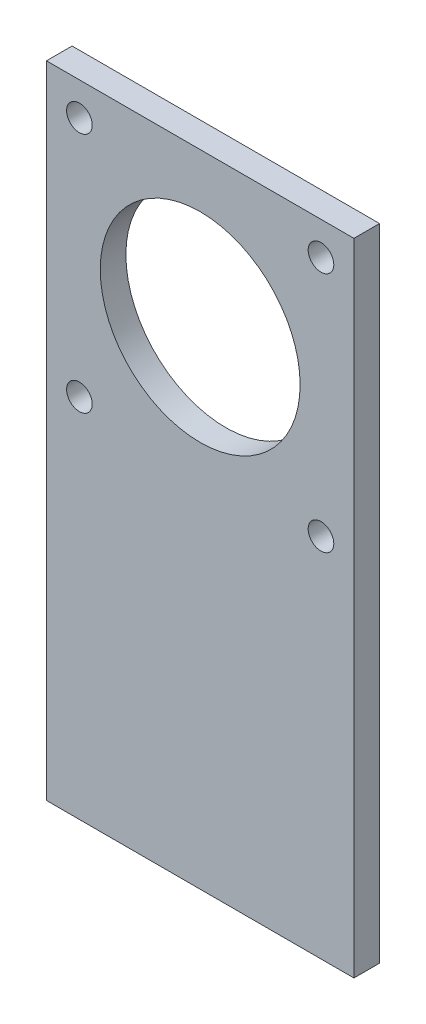
ISO-10303-21;
HEADER;
FILE_DESCRIPTION(('STEP AP214'),'2;1');
FILE_NAME('part.step','',(''),(''),'','','');
FILE_SCHEMA(('AUTOMOTIVE_DESIGN { 1 0 10303 214 1 1 1 1 }'));
ENDSEC;
DATA;
#1=APPLICATION_CONTEXT('core data for automotive mechanical design processes');
#2=APPLICATION_PROTOCOL_DEFINITION('international standard','automotive_design',2000,#1);
#3=PRODUCT_CONTEXT('',#1,'mechanical');
#4=PRODUCT('Part','Part','',(#3));
#5=PRODUCT_RELATED_PRODUCT_CATEGORY('part','',(#4));
#6=PRODUCT_DEFINITION_FORMATION('','',#4);
#7=PRODUCT_DEFINITION_CONTEXT('part definition',#1,'design');
#8=PRODUCT_DEFINITION('design','',#6,#7);
#9=PRODUCT_DEFINITION_SHAPE('','',#8);
#10=(LENGTH_UNIT() NAMED_UNIT(*) SI_UNIT(.MILLI.,.METRE.));
#11=(NAMED_UNIT(*) PLANE_ANGLE_UNIT() SI_UNIT($,.RADIAN.));
#12=(NAMED_UNIT(*) SI_UNIT($,.STERADIAN.) SOLID_ANGLE_UNIT());
#13=UNCERTAINTY_MEASURE_WITH_UNIT(LENGTH_MEASURE(1.E-05),#10,'distance_accuracy_value','');
#14=(GEOMETRIC_REPRESENTATION_CONTEXT(3) GLOBAL_UNCERTAINTY_ASSIGNED_CONTEXT((#13)) GLOBAL_UNIT_ASSIGNED_CONTEXT((#10,
#11,#12)) REPRESENTATION_CONTEXT('',''));
#15=CARTESIAN_POINT('',(0.,0.,0.));
#16=DIRECTION('',(0.,0.,1.));
#17=DIRECTION('',(1.,0.,0.));
#18=AXIS2_PLACEMENT_3D('',#15,#16,#17);
#19=CARTESIAN_POINT('',(30.,62.5,5.));
#20=DIRECTION('',(-1.,0.,0.));
#21=DIRECTION('',(0.,-1.,0.));
#22=AXIS2_PLACEMENT_3D('',#19,#20,#21);
#23=PLANE('',#22);
#24=DIRECTION('',(0.,1.,0.));
#25=VECTOR('',#24,1.);
#26=CARTESIAN_POINT('',(30.,62.5,0.));
#27=LINE('',#26,#25);
#28=CARTESIAN_POINT('',(30.,-62.5,0.));
#29=VERTEX_POINT('',#28);
#30=CARTESIAN_POINT('',(30.,62.5,0.));
#31=VERTEX_POINT('',#30);
#32=EDGE_CURVE('E106',#29,#31,#27,.T.);
#33=ORIENTED_EDGE('',*,*,#32,.T.);
#34=DIRECTION('',(0.,0.,-1.));
#35=VECTOR('',#34,1.);
#36=CARTESIAN_POINT('',(30.,62.5,5.));
#37=LINE('',#36,#35);
#38=CARTESIAN_POINT('',(30.,62.5,5.));
#39=VERTEX_POINT('',#38);
#40=EDGE_CURVE('E11',#39,#31,#37,.T.);
#41=ORIENTED_EDGE('',*,*,#40,.F.);
#42=DIRECTION('',(0.,1.,0.));
#43=VECTOR('',#42,1.);
#44=CARTESIAN_POINT('',(30.,62.5,5.));
#45=LINE('',#44,#43);
#46=CARTESIAN_POINT('',(30.,-62.5,5.));
#47=VERTEX_POINT('',#46);
#48=EDGE_CURVE('E94',#47,#39,#45,.T.);
#49=ORIENTED_EDGE('',*,*,#48,.F.);
#50=DIRECTION('',(0.,0.,-1.));
#51=VECTOR('',#50,1.);
#52=CARTESIAN_POINT('',(30.,-62.5,5.));
#53=LINE('',#52,#51);
#54=EDGE_CURVE('E102',#47,#29,#53,.T.);
#55=ORIENTED_EDGE('',*,*,#54,.T.);
#56=EDGE_LOOP('',(#33,#41,#49,#55));
#57=FACE_BOUND('',#56,.T.);
#58=ADVANCED_FACE('F43',(#57),#23,.F.);
#59=CARTESIAN_POINT('',(-30.,62.5,5.));
#60=DIRECTION('',(0.,-1.,0.));
#61=DIRECTION('',(0.,0.,-1.));
#62=AXIS2_PLACEMENT_3D('',#59,#60,#61);
#63=PLANE('',#62);
#64=DIRECTION('',(-1.,0.,0.));
#65=VECTOR('',#64,1.);
#66=CARTESIAN_POINT('',(-30.,62.5,0.));
#67=LINE('',#66,#65);
#68=CARTESIAN_POINT('',(-30.,62.5,0.));
#69=VERTEX_POINT('',#68);
#70=EDGE_CURVE('E98',#31,#69,#67,.T.);
#71=ORIENTED_EDGE('',*,*,#70,.T.);
#72=DIRECTION('',(0.,0.,-1.));
#73=VECTOR('',#72,1.);
#74=CARTESIAN_POINT('',(-30.,62.5,5.));
#75=LINE('',#74,#73);
#76=CARTESIAN_POINT('',(-30.,62.5,5.));
#77=VERTEX_POINT('',#76);
#78=EDGE_CURVE('E51',#77,#69,#75,.T.);
#79=ORIENTED_EDGE('',*,*,#78,.F.);
#80=DIRECTION('',(-1.,0.,0.));
#81=VECTOR('',#80,1.);
#82=CARTESIAN_POINT('',(-30.,62.5,5.));
#83=LINE('',#82,#81);
#84=EDGE_CURVE('E89',#39,#77,#83,.T.);
#85=ORIENTED_EDGE('',*,*,#84,.F.);
#86=ORIENTED_EDGE('',*,*,#40,.T.);
#87=EDGE_LOOP('',(#71,#79,#85,#86));
#88=FACE_BOUND('',#87,.T.);
#89=ADVANCED_FACE('F97',(#88),#63,.F.);
#90=CARTESIAN_POINT('',(-30.,62.5,5.));
#91=DIRECTION('',(1.,0.,0.));
#92=DIRECTION('',(0.,1.,0.));
#93=AXIS2_PLACEMENT_3D('',#90,#91,#92);
#94=PLANE('',#93);
#95=DIRECTION('',(0.,-1.,0.));
#96=VECTOR('',#95,1.);
#97=CARTESIAN_POINT('',(-30.,62.5,0.));
#98=LINE('',#97,#96);
#99=CARTESIAN_POINT('',(-30.,-62.5,0.));
#100=VERTEX_POINT('',#99);
#101=EDGE_CURVE('E76',#69,#100,#98,.T.);
#102=ORIENTED_EDGE('',*,*,#101,.T.);
#103=DIRECTION('',(0.,0.,-1.));
#104=VECTOR('',#103,1.);
#105=CARTESIAN_POINT('',(-30.,-62.5,5.));
#106=LINE('',#105,#104);
#107=CARTESIAN_POINT('',(-30.,-62.5,5.));
#108=VERTEX_POINT('',#107);
#109=EDGE_CURVE('E99',#108,#100,#106,.T.);
#110=ORIENTED_EDGE('',*,*,#109,.F.);
#111=DIRECTION('',(0.,-1.,0.));
#112=VECTOR('',#111,1.);
#113=CARTESIAN_POINT('',(-30.,62.5,5.));
#114=LINE('',#113,#112);
#115=EDGE_CURVE('E92',#77,#108,#114,.T.);
#116=ORIENTED_EDGE('',*,*,#115,.F.);
#117=ORIENTED_EDGE('',*,*,#78,.T.);
#118=EDGE_LOOP('',(#102,#110,#116,#117));
#119=FACE_BOUND('',#118,.T.);
#120=ADVANCED_FACE('F100',(#119),#94,.F.);
#121=CARTESIAN_POINT('',(-30.,-62.5,5.));
#122=DIRECTION('',(0.,1.,0.));
#123=DIRECTION('',(0.,0.,1.));
#124=AXIS2_PLACEMENT_3D('',#121,#122,#123);
#125=PLANE('',#124);
#126=DIRECTION('',(1.,0.,0.));
#127=VECTOR('',#126,1.);
#128=CARTESIAN_POINT('',(-30.,-62.5,0.));
#129=LINE('',#128,#127);
#130=EDGE_CURVE('E82',#100,#29,#129,.T.);
#131=ORIENTED_EDGE('',*,*,#130,.T.);
#132=ORIENTED_EDGE('',*,*,#54,.F.);
#133=DIRECTION('',(1.,0.,0.));
#134=VECTOR('',#133,1.);
#135=CARTESIAN_POINT('',(-30.,-62.5,5.));
#136=LINE('',#135,#134);
#137=EDGE_CURVE('E59',#108,#47,#136,.T.);
#138=ORIENTED_EDGE('',*,*,#137,.F.);
#139=ORIENTED_EDGE('',*,*,#109,.T.);
#140=EDGE_LOOP('',(#131,#132,#138,#139));
#141=FACE_BOUND('',#140,.T.);
#142=ADVANCED_FACE('F114',(#141),#125,.F.);
#143=CARTESIAN_POINT('',(0.,0.,5.));
#144=DIRECTION('',(0.,0.,1.));
#145=DIRECTION('',(1.,0.,0.));
#146=AXIS2_PLACEMENT_3D('',#143,#144,#145);
#147=PLANE('',#146);
#148=CARTESIAN_POINT('',(-23.57,56.07,5.));
#149=DIRECTION('',(0.,0.,1.));
#150=DIRECTION('',(1.,0.,0.));
#151=AXIS2_PLACEMENT_3D('',#148,#149,#150);
#152=CIRCLE('',#151,2.5);
#153=CARTESIAN_POINT('',(-21.07,56.07,5.));
#154=VERTEX_POINT('',#153);
#155=EDGE_CURVE('E135',#154,#154,#152,.T.);
#156=ORIENTED_EDGE('',*,*,#155,.F.);
#157=EDGE_LOOP('',(#156));
#158=FACE_BOUND('',#157,.T.);
#159=CARTESIAN_POINT('',(-23.57,8.93,5.));
#160=DIRECTION('',(0.,0.,1.));
#161=DIRECTION('',(1.,0.,0.));
#162=AXIS2_PLACEMENT_3D('',#159,#160,#161);
#163=CIRCLE('',#162,2.5);
#164=CARTESIAN_POINT('',(-21.07,8.93,5.));
#165=VERTEX_POINT('',#164);
#166=EDGE_CURVE('E141',#165,#165,#163,.T.);
#167=ORIENTED_EDGE('',*,*,#166,.F.);
#168=EDGE_LOOP('',(#167));
#169=FACE_BOUND('',#168,.T.);
#170=CARTESIAN_POINT('',(23.57,8.93,5.));
#171=DIRECTION('',(0.,0.,1.));
#172=DIRECTION('',(1.,0.,0.));
#173=AXIS2_PLACEMENT_3D('',#170,#171,#172);
#174=CIRCLE('',#173,2.5);
#175=CARTESIAN_POINT('',(26.07,8.93,5.));
#176=VERTEX_POINT('',#175);
#177=EDGE_CURVE('E129',#176,#176,#174,.T.);
#178=ORIENTED_EDGE('',*,*,#177,.F.);
#179=EDGE_LOOP('',(#178));
#180=FACE_BOUND('',#179,.T.);
#181=CARTESIAN_POINT('',(23.57,56.07,5.));
#182=DIRECTION('',(0.,0.,1.));
#183=DIRECTION('',(1.,0.,0.));
#184=AXIS2_PLACEMENT_3D('',#181,#182,#183);
#185=CIRCLE('',#184,2.5);
#186=CARTESIAN_POINT('',(26.07,56.07,5.));
#187=VERTEX_POINT('',#186);
#188=EDGE_CURVE('E126',#187,#187,#185,.T.);
#189=ORIENTED_EDGE('',*,*,#188,.F.);
#190=EDGE_LOOP('',(#189));
#191=FACE_BOUND('',#190,.T.);
#192=CARTESIAN_POINT('',(0.,32.5,5.));
#193=DIRECTION('',(0.,0.,1.));
#194=DIRECTION('',(1.,0.,0.));
#195=AXIS2_PLACEMENT_3D('',#192,#193,#194);
#196=CIRCLE('',#195,19.5);
#197=CARTESIAN_POINT('',(19.5,32.5,5.));
#198=VERTEX_POINT('',#197);
#199=EDGE_CURVE('E109',#198,#198,#196,.T.);
#200=ORIENTED_EDGE('',*,*,#199,.F.);
#201=EDGE_LOOP('',(#200));
#202=FACE_BOUND('',#201,.T.);
#203=ORIENTED_EDGE('',*,*,#48,.T.);
#204=ORIENTED_EDGE('',*,*,#84,.T.);
#205=ORIENTED_EDGE('',*,*,#115,.T.);
#206=ORIENTED_EDGE('',*,*,#137,.T.);
#207=EDGE_LOOP('',(#203,#204,#205,#206));
#208=FACE_BOUND('',#207,.T.);
#209=ADVANCED_FACE('F90',(#158,#169,#180,#191,#202,#208),#147,.T.);
#210=CARTESIAN_POINT('',(0.,0.,0.));
#211=DIRECTION('',(0.,0.,1.));
#212=DIRECTION('',(1.,0.,0.));
#213=AXIS2_PLACEMENT_3D('',#210,#211,#212);
#214=PLANE('',#213);
#215=CARTESIAN_POINT('',(-23.57,56.07,0.));
#216=DIRECTION('',(0.,0.,1.));
#217=DIRECTION('',(1.,0.,0.));
#218=AXIS2_PLACEMENT_3D('',#215,#216,#217);
#219=CIRCLE('',#218,2.5);
#220=CARTESIAN_POINT('',(-21.07,56.07,0.));
#221=VERTEX_POINT('',#220);
#222=EDGE_CURVE('E132',#221,#221,#219,.T.);
#223=ORIENTED_EDGE('',*,*,#222,.T.);
#224=EDGE_LOOP('',(#223));
#225=FACE_BOUND('',#224,.T.);
#226=CARTESIAN_POINT('',(-23.57,8.93,0.));
#227=DIRECTION('',(0.,0.,1.));
#228=DIRECTION('',(1.,0.,0.));
#229=AXIS2_PLACEMENT_3D('',#226,#227,#228);
#230=CIRCLE('',#229,2.5);
#231=CARTESIAN_POINT('',(-21.07,8.93,0.));
#232=VERTEX_POINT('',#231);
#233=EDGE_CURVE('E138',#232,#232,#230,.T.);
#234=ORIENTED_EDGE('',*,*,#233,.T.);
#235=EDGE_LOOP('',(#234));
#236=FACE_BOUND('',#235,.T.);
#237=CARTESIAN_POINT('',(23.57,8.93,0.));
#238=DIRECTION('',(0.,0.,1.));
#239=DIRECTION('',(1.,0.,0.));
#240=AXIS2_PLACEMENT_3D('',#237,#238,#239);
#241=CIRCLE('',#240,2.5);
#242=CARTESIAN_POINT('',(26.07,8.93,0.));
#243=VERTEX_POINT('',#242);
#244=EDGE_CURVE('E144',#243,#243,#241,.T.);
#245=ORIENTED_EDGE('',*,*,#244,.T.);
#246=EDGE_LOOP('',(#245));
#247=FACE_BOUND('',#246,.T.);
#248=CARTESIAN_POINT('',(23.57,56.07,0.));
#249=DIRECTION('',(0.,0.,1.));
#250=DIRECTION('',(1.,0.,0.));
#251=AXIS2_PLACEMENT_3D('',#248,#249,#250);
#252=CIRCLE('',#251,2.5);
#253=CARTESIAN_POINT('',(26.07,56.07,0.));
#254=VERTEX_POINT('',#253);
#255=EDGE_CURVE('E125',#254,#254,#252,.T.);
#256=ORIENTED_EDGE('',*,*,#255,.T.);
#257=EDGE_LOOP('',(#256));
#258=FACE_BOUND('',#257,.T.);
#259=CARTESIAN_POINT('',(0.,32.5,0.));
#260=DIRECTION('',(0.,0.,-1.));
#261=DIRECTION('',(-1.,0.,0.));
#262=AXIS2_PLACEMENT_3D('',#259,#260,#261);
#263=CIRCLE('',#262,19.5);
#264=CARTESIAN_POINT('',(-19.5,32.5,0.));
#265=VERTEX_POINT('',#264);
#266=EDGE_CURVE('E122',#265,#265,#263,.T.);
#267=ORIENTED_EDGE('',*,*,#266,.F.);
#268=EDGE_LOOP('',(#267));
#269=FACE_BOUND('',#268,.T.);
#270=ORIENTED_EDGE('',*,*,#32,.F.);
#271=ORIENTED_EDGE('',*,*,#130,.F.);
#272=ORIENTED_EDGE('',*,*,#101,.F.);
#273=ORIENTED_EDGE('',*,*,#70,.F.);
#274=EDGE_LOOP('',(#270,#271,#272,#273));
#275=FACE_BOUND('',#274,.T.);
#276=ADVANCED_FACE('F117',(#225,#236,#247,#258,#269,#275),#214,.F.);
#277=CARTESIAN_POINT('',(0.,32.5,10.));
#278=DIRECTION('',(0.,0.,-1.));
#279=DIRECTION('',(-1.,0.,0.));
#280=AXIS2_PLACEMENT_3D('',#277,#278,#279);
#281=CYLINDRICAL_SURFACE('',#280,19.5);
#282=ORIENTED_EDGE('',*,*,#199,.T.);
#283=EDGE_LOOP('',(#282));
#284=FACE_BOUND('',#283,.T.);
#285=ORIENTED_EDGE('',*,*,#266,.T.);
#286=EDGE_LOOP('',(#285));
#287=FACE_BOUND('',#286,.T.);
#288=ADVANCED_FACE('F160',(#284,#287),#281,.F.);
#289=CARTESIAN_POINT('',(23.57,56.07,0.));
#290=DIRECTION('',(0.,0.,1.));
#291=DIRECTION('',(1.,0.,0.));
#292=AXIS2_PLACEMENT_3D('',#289,#290,#291);
#293=CYLINDRICAL_SURFACE('',#292,2.5);
#294=ORIENTED_EDGE('',*,*,#255,.F.);
#295=EDGE_LOOP('',(#294));
#296=FACE_BOUND('',#295,.T.);
#297=ORIENTED_EDGE('',*,*,#188,.T.);
#298=EDGE_LOOP('',(#297));
#299=FACE_BOUND('',#298,.T.);
#300=ADVANCED_FACE('F163',(#296,#299),#293,.F.);
#301=CARTESIAN_POINT('',(23.57,8.93,0.));
#302=DIRECTION('',(0.,0.,1.));
#303=DIRECTION('',(1.,0.,0.));
#304=AXIS2_PLACEMENT_3D('',#301,#302,#303);
#305=CYLINDRICAL_SURFACE('',#304,2.5);
#306=ORIENTED_EDGE('',*,*,#244,.F.);
#307=EDGE_LOOP('',(#306));
#308=FACE_BOUND('',#307,.T.);
#309=ORIENTED_EDGE('',*,*,#177,.T.);
#310=EDGE_LOOP('',(#309));
#311=FACE_BOUND('',#310,.T.);
#312=ADVANCED_FACE('F150',(#308,#311),#305,.F.);
#313=CARTESIAN_POINT('',(-23.57,8.93,0.));
#314=DIRECTION('',(0.,0.,1.));
#315=DIRECTION('',(1.,0.,0.));
#316=AXIS2_PLACEMENT_3D('',#313,#314,#315);
#317=CYLINDRICAL_SURFACE('',#316,2.5);
#318=ORIENTED_EDGE('',*,*,#233,.F.);
#319=EDGE_LOOP('',(#318));
#320=FACE_BOUND('',#319,.T.);
#321=ORIENTED_EDGE('',*,*,#166,.T.);
#322=EDGE_LOOP('',(#321));
#323=FACE_BOUND('',#322,.T.);
#324=ADVANCED_FACE('F219',(#320,#323),#317,.F.);
#325=CARTESIAN_POINT('',(-23.57,56.07,0.));
#326=DIRECTION('',(0.,0.,1.));
#327=DIRECTION('',(1.,0.,0.));
#328=AXIS2_PLACEMENT_3D('',#325,#326,#327);
#329=CYLINDRICAL_SURFACE('',#328,2.5);
#330=ORIENTED_EDGE('',*,*,#222,.F.);
#331=EDGE_LOOP('',(#330));
#332=FACE_BOUND('',#331,.T.);
#333=ORIENTED_EDGE('',*,*,#155,.T.);
#334=EDGE_LOOP('',(#333));
#335=FACE_BOUND('',#334,.T.);
#336=ADVANCED_FACE('F230',(#332,#335),#329,.F.);
#337=CLOSED_SHELL('',(#58,#89,#120,#142,#209,#276,#288,#300,#312,#324,#336));
#338=MANIFOLD_SOLID_BREP('B2',#337);
#339=ADVANCED_BREP_SHAPE_REPRESENTATION('',(#18,#338),#14);
#340=SHAPE_DEFINITION_REPRESENTATION(#9,#339);
ENDSEC;
END-ISO-10303-21;
